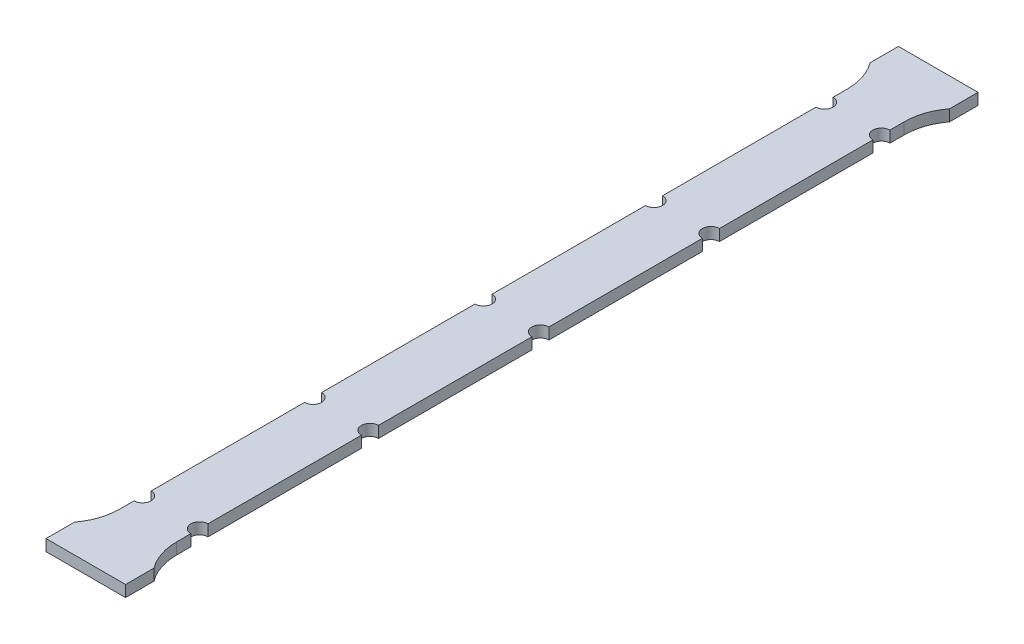
ISO-10303-21;
HEADER;
FILE_DESCRIPTION(('STEP AP214'),'2;1');
FILE_NAME('part.step','',(''),(''),'','','');
FILE_SCHEMA(('AUTOMOTIVE_DESIGN { 1 0 10303 214 1 1 1 1 }'));
ENDSEC;
DATA;
#1=APPLICATION_CONTEXT('core data for automotive mechanical design processes');
#2=APPLICATION_PROTOCOL_DEFINITION('international standard','automotive_design',2000,#1);
#3=PRODUCT_CONTEXT('',#1,'mechanical');
#4=PRODUCT('Part','Part','',(#3));
#5=PRODUCT_RELATED_PRODUCT_CATEGORY('part','',(#4));
#6=PRODUCT_DEFINITION_FORMATION('','',#4);
#7=PRODUCT_DEFINITION_CONTEXT('part definition',#1,'design');
#8=PRODUCT_DEFINITION('design','',#6,#7);
#9=PRODUCT_DEFINITION_SHAPE('','',#8);
#10=(LENGTH_UNIT() NAMED_UNIT(*) SI_UNIT(.MILLI.,.METRE.));
#11=(NAMED_UNIT(*) PLANE_ANGLE_UNIT() SI_UNIT($,.RADIAN.));
#12=(NAMED_UNIT(*) SI_UNIT($,.STERADIAN.) SOLID_ANGLE_UNIT());
#13=UNCERTAINTY_MEASURE_WITH_UNIT(LENGTH_MEASURE(1.E-05),#10,'distance_accuracy_value','');
#14=(GEOMETRIC_REPRESENTATION_CONTEXT(3) GLOBAL_UNCERTAINTY_ASSIGNED_CONTEXT((#13)) GLOBAL_UNIT_ASSIGNED_CONTEXT((#10,
#11,#12)) REPRESENTATION_CONTEXT('',''));
#15=CARTESIAN_POINT('',(0.,0.,0.));
#16=DIRECTION('',(0.,0.,1.));
#17=DIRECTION('',(1.,0.,0.));
#18=AXIS2_PLACEMENT_3D('',#15,#16,#17);
#19=CARTESIAN_POINT('',(0.,2.,75.0000000000001));
#20=DIRECTION('',(0.,-1.,0.));
#21=DIRECTION('',(0.,0.,-1.));
#22=AXIS2_PLACEMENT_3D('',#19,#20,#21);
#23=CYLINDRICAL_SURFACE('',#22,1.5);
#24=CARTESIAN_POINT('',(0.,0.,75.0000000000001));
#25=DIRECTION('',(0.,1.,0.));
#26=DIRECTION('',(0.,0.,1.));
#27=AXIS2_PLACEMENT_3D('',#24,#25,#26);
#28=CIRCLE('',#27,1.5);
#29=CARTESIAN_POINT('',(0.,0.,76.5000000000001));
#30=VERTEX_POINT('',#29);
#31=CARTESIAN_POINT('',(0.,0.,73.5000000000001));
#32=VERTEX_POINT('',#31);
#33=EDGE_CURVE('E261',#30,#32,#28,.T.);
#34=ORIENTED_EDGE('',*,*,#33,.F.);
#35=DIRECTION('',(0.,-1.,0.));
#36=VECTOR('',#35,1.);
#37=CARTESIAN_POINT('',(0.,2.,76.5000000000001));
#38=LINE('',#37,#36);
#39=CARTESIAN_POINT('',(0.,2.,76.5000000000001));
#40=VERTEX_POINT('',#39);
#41=EDGE_CURVE('E256',#40,#30,#38,.T.);
#42=ORIENTED_EDGE('',*,*,#41,.F.);
#43=CARTESIAN_POINT('',(0.,2.,75.0000000000001));
#44=DIRECTION('',(0.,1.,0.));
#45=DIRECTION('',(0.,0.,1.));
#46=AXIS2_PLACEMENT_3D('',#43,#44,#45);
#47=CIRCLE('',#46,1.5);
#48=CARTESIAN_POINT('',(0.,2.,73.5000000000001));
#49=VERTEX_POINT('',#48);
#50=EDGE_CURVE('E259',#40,#49,#47,.T.);
#51=ORIENTED_EDGE('',*,*,#50,.T.);
#52=DIRECTION('',(0.,-1.,0.));
#53=VECTOR('',#52,1.);
#54=CARTESIAN_POINT('',(0.,2.,73.5000000000001));
#55=LINE('',#54,#53);
#56=EDGE_CURVE('E458',#49,#32,#55,.T.);
#57=ORIENTED_EDGE('',*,*,#56,.T.);
#58=EDGE_LOOP('',(#34,#42,#51,#57));
#59=FACE_BOUND('',#58,.T.);
#60=ADVANCED_FACE('F46',(#59),#23,.F.);
#61=CARTESIAN_POINT('',(0.,2.,0.));
#62=DIRECTION('',(1.,0.,0.));
#63=DIRECTION('',(0.,0.,-1.));
#64=AXIS2_PLACEMENT_3D('',#61,#62,#63);
#65=PLANE('',#64);
#66=DIRECTION('',(0.,0.,1.));
#67=VECTOR('',#66,1.);
#68=CARTESIAN_POINT('',(0.,0.,0.));
#69=LINE('',#68,#67);
#70=CARTESIAN_POINT('',(0.,0.,103.5));
#71=VERTEX_POINT('',#70);
#72=EDGE_CURVE('E403',#30,#71,#69,.T.);
#73=ORIENTED_EDGE('',*,*,#72,.T.);
#74=DIRECTION('',(0.,-1.,0.));
#75=VECTOR('',#74,1.);
#76=CARTESIAN_POINT('',(0.,2.,103.5));
#77=LINE('',#76,#75);
#78=CARTESIAN_POINT('',(0.,2.,103.5));
#79=VERTEX_POINT('',#78);
#80=EDGE_CURVE('E266',#79,#71,#77,.T.);
#81=ORIENTED_EDGE('',*,*,#80,.F.);
#82=DIRECTION('',(0.,0.,1.));
#83=VECTOR('',#82,1.);
#84=CARTESIAN_POINT('',(0.,2.,0.));
#85=LINE('',#84,#83);
#86=EDGE_CURVE('E269',#40,#79,#85,.T.);
#87=ORIENTED_EDGE('',*,*,#86,.F.);
#88=ORIENTED_EDGE('',*,*,#41,.T.);
#89=EDGE_LOOP('',(#73,#81,#87,#88));
#90=FACE_BOUND('',#89,.T.);
#91=ADVANCED_FACE('F270',(#90),#65,.F.);
#92=CARTESIAN_POINT('',(3.3133218391157E-13,2.,105.));
#93=DIRECTION('',(0.,-1.,0.));
#94=DIRECTION('',(0.,0.,-1.));
#95=AXIS2_PLACEMENT_3D('',#92,#93,#94);
#96=CYLINDRICAL_SURFACE('',#95,1.5);
#97=CARTESIAN_POINT('',(3.3133218391157E-13,0.,105.));
#98=DIRECTION('',(0.,1.,0.));
#99=DIRECTION('',(0.,0.,1.));
#100=AXIS2_PLACEMENT_3D('',#97,#98,#99);
#101=CIRCLE('',#100,1.5);
#102=CARTESIAN_POINT('',(0.,0.,106.5));
#103=VERTEX_POINT('',#102);
#104=EDGE_CURVE('E405',#103,#71,#101,.T.);
#105=ORIENTED_EDGE('',*,*,#104,.F.);
#106=DIRECTION('',(0.,-1.,0.));
#107=VECTOR('',#106,1.);
#108=CARTESIAN_POINT('',(0.,2.,106.5));
#109=LINE('',#108,#107);
#110=CARTESIAN_POINT('',(0.,2.,106.5));
#111=VERTEX_POINT('',#110);
#112=EDGE_CURVE('E516',#111,#103,#109,.T.);
#113=ORIENTED_EDGE('',*,*,#112,.F.);
#114=CARTESIAN_POINT('',(3.3133218391157E-13,2.,105.));
#115=DIRECTION('',(0.,1.,0.));
#116=DIRECTION('',(0.,0.,1.));
#117=AXIS2_PLACEMENT_3D('',#114,#115,#116);
#118=CIRCLE('',#117,1.5);
#119=EDGE_CURVE('E275',#111,#79,#118,.T.);
#120=ORIENTED_EDGE('',*,*,#119,.T.);
#121=ORIENTED_EDGE('',*,*,#80,.T.);
#122=EDGE_LOOP('',(#105,#113,#120,#121));
#123=FACE_BOUND('',#122,.T.);
#124=ADVANCED_FACE('F670',(#123),#96,.F.);
#125=CARTESIAN_POINT('',(0.,0.,133.5));
#126=VERTEX_POINT('',#125);
#127=EDGE_CURVE('E407',#103,#126,#69,.T.);
#128=ORIENTED_EDGE('',*,*,#127,.T.);
#129=DIRECTION('',(0.,-1.,0.));
#130=VECTOR('',#129,1.);
#131=CARTESIAN_POINT('',(0.,2.,133.5));
#132=LINE('',#131,#130);
#133=CARTESIAN_POINT('',(0.,2.,133.5));
#134=VERTEX_POINT('',#133);
#135=EDGE_CURVE('E514',#134,#126,#132,.T.);
#136=ORIENTED_EDGE('',*,*,#135,.F.);
#137=EDGE_CURVE('E278',#111,#134,#85,.T.);
#138=ORIENTED_EDGE('',*,*,#137,.F.);
#139=ORIENTED_EDGE('',*,*,#112,.T.);
#140=EDGE_LOOP('',(#128,#136,#138,#139));
#141=FACE_BOUND('',#140,.T.);
#142=ADVANCED_FACE('F660',(#141),#65,.F.);
#143=CARTESIAN_POINT('',(6.43582409587395E-13,2.,135.));
#144=DIRECTION('',(0.,-1.,0.));
#145=DIRECTION('',(0.,0.,-1.));
#146=AXIS2_PLACEMENT_3D('',#143,#144,#145);
#147=CYLINDRICAL_SURFACE('',#146,1.5);
#148=CARTESIAN_POINT('',(6.43582409587395E-13,0.,135.));
#149=DIRECTION('',(0.,1.,0.));
#150=DIRECTION('',(0.,0.,1.));
#151=AXIS2_PLACEMENT_3D('',#148,#149,#150);
#152=CIRCLE('',#151,1.5);
#153=CARTESIAN_POINT('',(0.,0.,136.5));
#154=VERTEX_POINT('',#153);
#155=EDGE_CURVE('E410',#154,#126,#152,.T.);
#156=ORIENTED_EDGE('',*,*,#155,.F.);
#157=DIRECTION('',(0.,-1.,0.));
#158=VECTOR('',#157,1.);
#159=CARTESIAN_POINT('',(0.,2.,136.5));
#160=LINE('',#159,#158);
#161=CARTESIAN_POINT('',(0.,2.,136.5));
#162=VERTEX_POINT('',#161);
#163=EDGE_CURVE('E512',#162,#154,#160,.T.);
#164=ORIENTED_EDGE('',*,*,#163,.F.);
#165=CARTESIAN_POINT('',(6.43582409587395E-13,2.,135.));
#166=DIRECTION('',(0.,1.,0.));
#167=DIRECTION('',(0.,0.,1.));
#168=AXIS2_PLACEMENT_3D('',#165,#166,#167);
#169=CIRCLE('',#168,1.5);
#170=EDGE_CURVE('E303',#162,#134,#169,.T.);
#171=ORIENTED_EDGE('',*,*,#170,.T.);
#172=ORIENTED_EDGE('',*,*,#135,.T.);
#173=EDGE_LOOP('',(#156,#164,#171,#172));
#174=FACE_BOUND('',#173,.T.);
#175=ADVANCED_FACE('F664',(#174),#147,.F.);
#176=CARTESIAN_POINT('',(0.,0.,139.));
#177=VERTEX_POINT('',#176);
#178=EDGE_CURVE('E406',#154,#177,#69,.T.);
#179=ORIENTED_EDGE('',*,*,#178,.T.);
#180=DIRECTION('',(0.,1.,0.));
#181=VECTOR('',#180,1.);
#182=CARTESIAN_POINT('',(0.,2.,139.));
#183=LINE('',#182,#181);
#184=CARTESIAN_POINT('',(0.,2.,139.));
#185=VERTEX_POINT('',#184);
#186=EDGE_CURVE('E521',#177,#185,#183,.T.);
#187=ORIENTED_EDGE('',*,*,#186,.T.);
#188=EDGE_CURVE('E277',#162,#185,#85,.T.);
#189=ORIENTED_EDGE('',*,*,#188,.F.);
#190=ORIENTED_EDGE('',*,*,#163,.T.);
#191=EDGE_LOOP('',(#179,#187,#189,#190));
#192=FACE_BOUND('',#191,.T.);
#193=ADVANCED_FACE('F653',(#192),#65,.F.);
#194=CARTESIAN_POINT('',(-1.99999999999998,2.,0.));
#195=DIRECTION('',(-1.,0.,0.));
#196=DIRECTION('',(0.,0.,1.));
#197=AXIS2_PLACEMENT_3D('',#194,#195,#196);
#198=PLANE('',#197);
#199=DIRECTION('',(0.,0.,-1.));
#200=VECTOR('',#199,1.);
#201=CARTESIAN_POINT('',(-1.99999999999998,0.,0.));
#202=LINE('',#201,#200);
#203=CARTESIAN_POINT('',(-1.99999999999998,0.,150.));
#204=VERTEX_POINT('',#203);
#205=CARTESIAN_POINT('',(-1.99999999999998,0.,145.));
#206=VERTEX_POINT('',#205);
#207=EDGE_CURVE('E413',#204,#206,#202,.T.);
#208=ORIENTED_EDGE('',*,*,#207,.F.);
#209=DIRECTION('',(0.,-1.,0.));
#210=VECTOR('',#209,1.);
#211=CARTESIAN_POINT('',(-1.99999999999998,2.,150.));
#212=LINE('',#211,#210);
#213=CARTESIAN_POINT('',(-1.99999999999998,2.,150.));
#214=VERTEX_POINT('',#213);
#215=EDGE_CURVE('E507',#214,#204,#212,.T.);
#216=ORIENTED_EDGE('',*,*,#215,.F.);
#217=DIRECTION('',(0.,0.,-1.));
#218=VECTOR('',#217,1.);
#219=CARTESIAN_POINT('',(-1.99999999999998,2.,0.));
#220=LINE('',#219,#218);
#221=CARTESIAN_POINT('',(-1.99999999999998,2.,145.));
#222=VERTEX_POINT('',#221);
#223=EDGE_CURVE('E308',#214,#222,#220,.T.);
#224=ORIENTED_EDGE('',*,*,#223,.T.);
#225=DIRECTION('',(0.,-1.,0.));
#226=VECTOR('',#225,1.);
#227=CARTESIAN_POINT('',(-1.99999999999998,2.,145.));
#228=LINE('',#227,#226);
#229=EDGE_CURVE('E509',#222,#206,#228,.T.);
#230=ORIENTED_EDGE('',*,*,#229,.T.);
#231=EDGE_LOOP('',(#208,#216,#224,#230));
#232=FACE_BOUND('',#231,.T.);
#233=ADVANCED_FACE('F640',(#232),#198,.T.);
#234=CARTESIAN_POINT('',(0.,2.,150.));
#235=DIRECTION('',(0.,0.,-1.));
#236=DIRECTION('',(-1.,0.,0.));
#237=AXIS2_PLACEMENT_3D('',#234,#235,#236);
#238=PLANE('',#237);
#239=DIRECTION('',(1.,0.,0.));
#240=VECTOR('',#239,1.);
#241=CARTESIAN_POINT('',(0.,0.,150.));
#242=LINE('',#241,#240);
#243=CARTESIAN_POINT('',(12.,0.,150.));
#244=VERTEX_POINT('',#243);
#245=EDGE_CURVE('E416',#204,#244,#242,.T.);
#246=ORIENTED_EDGE('',*,*,#245,.T.);
#247=DIRECTION('',(0.,-1.,0.));
#248=VECTOR('',#247,1.);
#249=CARTESIAN_POINT('',(12.,2.,150.));
#250=LINE('',#249,#248);
#251=CARTESIAN_POINT('',(12.,2.,150.));
#252=VERTEX_POINT('',#251);
#253=EDGE_CURVE('E504',#252,#244,#250,.T.);
#254=ORIENTED_EDGE('',*,*,#253,.F.);
#255=DIRECTION('',(1.,0.,0.));
#256=VECTOR('',#255,1.);
#257=CARTESIAN_POINT('',(0.,2.,150.));
#258=LINE('',#257,#256);
#259=EDGE_CURVE('E317',#214,#252,#258,.T.);
#260=ORIENTED_EDGE('',*,*,#259,.F.);
#261=ORIENTED_EDGE('',*,*,#215,.T.);
#262=EDGE_LOOP('',(#246,#254,#260,#261));
#263=FACE_BOUND('',#262,.T.);
#264=ADVANCED_FACE('F814',(#263),#238,.F.);
#265=CARTESIAN_POINT('',(12.,2.,0.));
#266=DIRECTION('',(-1.,0.,0.));
#267=DIRECTION('',(0.,0.,1.));
#268=AXIS2_PLACEMENT_3D('',#265,#266,#267);
#269=PLANE('',#268);
#270=DIRECTION('',(0.,0.,-1.));
#271=VECTOR('',#270,1.);
#272=CARTESIAN_POINT('',(12.,0.,0.));
#273=LINE('',#272,#271);
#274=CARTESIAN_POINT('',(12.,0.,145.));
#275=VERTEX_POINT('',#274);
#276=EDGE_CURVE('E418',#244,#275,#273,.T.);
#277=ORIENTED_EDGE('',*,*,#276,.T.);
#278=DIRECTION('',(0.,-1.,0.));
#279=VECTOR('',#278,1.);
#280=CARTESIAN_POINT('',(12.,2.,145.));
#281=LINE('',#280,#279);
#282=CARTESIAN_POINT('',(12.,2.,145.));
#283=VERTEX_POINT('',#282);
#284=EDGE_CURVE('E501',#283,#275,#281,.T.);
#285=ORIENTED_EDGE('',*,*,#284,.F.);
#286=DIRECTION('',(0.,0.,-1.));
#287=VECTOR('',#286,1.);
#288=CARTESIAN_POINT('',(12.,2.,0.));
#289=LINE('',#288,#287);
#290=EDGE_CURVE('E320',#252,#283,#289,.T.);
#291=ORIENTED_EDGE('',*,*,#290,.F.);
#292=ORIENTED_EDGE('',*,*,#253,.T.);
#293=EDGE_LOOP('',(#277,#285,#291,#292));
#294=FACE_BOUND('',#293,.T.);
#295=ADVANCED_FACE('F634',(#294),#269,.F.);
#296=CARTESIAN_POINT('',(10.,2.,0.));
#297=DIRECTION('',(-1.,0.,0.));
#298=DIRECTION('',(0.,0.,1.));
#299=AXIS2_PLACEMENT_3D('',#296,#297,#298);
#300=PLANE('',#299);
#301=DIRECTION('',(0.,0.,-1.));
#302=VECTOR('',#301,1.);
#303=CARTESIAN_POINT('',(10.,2.,0.));
#304=LINE('',#303,#302);
#305=CARTESIAN_POINT('',(10.,2.,139.));
#306=VERTEX_POINT('',#305);
#307=CARTESIAN_POINT('',(10.,2.,136.5));
#308=VERTEX_POINT('',#307);
#309=EDGE_CURVE('E324',#306,#308,#304,.T.);
#310=ORIENTED_EDGE('',*,*,#309,.F.);
#311=DIRECTION('',(0.,-1.,0.));
#312=VECTOR('',#311,1.);
#313=CARTESIAN_POINT('',(10.,2.,139.));
#314=LINE('',#313,#312);
#315=CARTESIAN_POINT('',(10.,0.,139.));
#316=VERTEX_POINT('',#315);
#317=EDGE_CURVE('E265',#306,#316,#314,.T.);
#318=ORIENTED_EDGE('',*,*,#317,.T.);
#319=DIRECTION('',(0.,0.,-1.));
#320=VECTOR('',#319,1.);
#321=CARTESIAN_POINT('',(10.,0.,0.));
#322=LINE('',#321,#320);
#323=CARTESIAN_POINT('',(10.,0.,136.5));
#324=VERTEX_POINT('',#323);
#325=EDGE_CURVE('E421',#316,#324,#322,.T.);
#326=ORIENTED_EDGE('',*,*,#325,.T.);
#327=DIRECTION('',(0.,-1.,0.));
#328=VECTOR('',#327,1.);
#329=CARTESIAN_POINT('',(10.,2.,136.5));
#330=LINE('',#329,#328);
#331=EDGE_CURVE('E498',#308,#324,#330,.T.);
#332=ORIENTED_EDGE('',*,*,#331,.F.);
#333=EDGE_LOOP('',(#310,#318,#326,#332));
#334=FACE_BOUND('',#333,.T.);
#335=ADVANCED_FACE('F626',(#334),#300,.F.);
#336=CARTESIAN_POINT('',(10.0000000000006,2.,135.));
#337=DIRECTION('',(0.,-1.,0.));
#338=DIRECTION('',(0.,0.,-1.));
#339=AXIS2_PLACEMENT_3D('',#336,#337,#338);
#340=CYLINDRICAL_SURFACE('',#339,1.5);
#341=CARTESIAN_POINT('',(10.0000000000006,0.,135.));
#342=DIRECTION('',(0.,1.,0.));
#343=DIRECTION('',(0.,0.,1.));
#344=AXIS2_PLACEMENT_3D('',#341,#342,#343);
#345=CIRCLE('',#344,1.5);
#346=CARTESIAN_POINT('',(10.,0.,133.5));
#347=VERTEX_POINT('',#346);
#348=EDGE_CURVE('E423',#347,#324,#345,.T.);
#349=ORIENTED_EDGE('',*,*,#348,.F.);
#350=DIRECTION('',(0.,-1.,0.));
#351=VECTOR('',#350,1.);
#352=CARTESIAN_POINT('',(10.,2.,133.5));
#353=LINE('',#352,#351);
#354=CARTESIAN_POINT('',(10.,2.,133.5));
#355=VERTEX_POINT('',#354);
#356=EDGE_CURVE('E496',#355,#347,#353,.T.);
#357=ORIENTED_EDGE('',*,*,#356,.F.);
#358=CARTESIAN_POINT('',(10.0000000000006,2.,135.));
#359=DIRECTION('',(0.,1.,0.));
#360=DIRECTION('',(0.,0.,1.));
#361=AXIS2_PLACEMENT_3D('',#358,#359,#360);
#362=CIRCLE('',#361,1.5);
#363=EDGE_CURVE('E328',#355,#308,#362,.T.);
#364=ORIENTED_EDGE('',*,*,#363,.T.);
#365=ORIENTED_EDGE('',*,*,#331,.T.);
#366=EDGE_LOOP('',(#349,#357,#364,#365));
#367=FACE_BOUND('',#366,.T.);
#368=ADVANCED_FACE('F620',(#367),#340,.F.);
#369=CARTESIAN_POINT('',(10.,0.,106.5));
#370=VERTEX_POINT('',#369);
#371=EDGE_CURVE('E425',#347,#370,#322,.T.);
#372=ORIENTED_EDGE('',*,*,#371,.T.);
#373=DIRECTION('',(0.,-1.,0.));
#374=VECTOR('',#373,1.);
#375=CARTESIAN_POINT('',(10.,2.,106.5));
#376=LINE('',#375,#374);
#377=CARTESIAN_POINT('',(10.,2.,106.5));
#378=VERTEX_POINT('',#377);
#379=EDGE_CURVE('E494',#378,#370,#376,.T.);
#380=ORIENTED_EDGE('',*,*,#379,.F.);
#381=EDGE_CURVE('E330',#355,#378,#304,.T.);
#382=ORIENTED_EDGE('',*,*,#381,.F.);
#383=ORIENTED_EDGE('',*,*,#356,.T.);
#384=EDGE_LOOP('',(#372,#380,#382,#383));
#385=FACE_BOUND('',#384,.T.);
#386=ADVANCED_FACE('F608',(#385),#300,.F.);
#387=CARTESIAN_POINT('',(10.0000000000003,2.,105.));
#388=DIRECTION('',(0.,-1.,0.));
#389=DIRECTION('',(0.,0.,-1.));
#390=AXIS2_PLACEMENT_3D('',#387,#388,#389);
#391=CYLINDRICAL_SURFACE('',#390,1.5);
#392=CARTESIAN_POINT('',(10.0000000000003,0.,105.));
#393=DIRECTION('',(0.,1.,0.));
#394=DIRECTION('',(0.,0.,1.));
#395=AXIS2_PLACEMENT_3D('',#392,#393,#394);
#396=CIRCLE('',#395,1.5);
#397=CARTESIAN_POINT('',(10.,0.,103.5));
#398=VERTEX_POINT('',#397);
#399=EDGE_CURVE('E428',#398,#370,#396,.T.);
#400=ORIENTED_EDGE('',*,*,#399,.F.);
#401=DIRECTION('',(0.,-1.,0.));
#402=VECTOR('',#401,1.);
#403=CARTESIAN_POINT('',(10.,2.,103.5));
#404=LINE('',#403,#402);
#405=CARTESIAN_POINT('',(10.,2.,103.5));
#406=VERTEX_POINT('',#405);
#407=EDGE_CURVE('E492',#406,#398,#404,.T.);
#408=ORIENTED_EDGE('',*,*,#407,.F.);
#409=CARTESIAN_POINT('',(10.0000000000003,2.,105.));
#410=DIRECTION('',(0.,1.,0.));
#411=DIRECTION('',(0.,0.,1.));
#412=AXIS2_PLACEMENT_3D('',#409,#410,#411);
#413=CIRCLE('',#412,1.5);
#414=EDGE_CURVE('E340',#406,#378,#413,.T.);
#415=ORIENTED_EDGE('',*,*,#414,.T.);
#416=ORIENTED_EDGE('',*,*,#379,.T.);
#417=EDGE_LOOP('',(#400,#408,#415,#416));
#418=FACE_BOUND('',#417,.T.);
#419=ADVANCED_FACE('F612',(#418),#391,.F.);
#420=CARTESIAN_POINT('',(10.,0.,76.5));
#421=VERTEX_POINT('',#420);
#422=EDGE_CURVE('E424',#398,#421,#322,.T.);
#423=ORIENTED_EDGE('',*,*,#422,.T.);
#424=DIRECTION('',(0.,-1.,0.));
#425=VECTOR('',#424,1.);
#426=CARTESIAN_POINT('',(10.,2.,76.5));
#427=LINE('',#426,#425);
#428=CARTESIAN_POINT('',(10.,2.,76.5));
#429=VERTEX_POINT('',#428);
#430=EDGE_CURVE('E490',#429,#421,#427,.T.);
#431=ORIENTED_EDGE('',*,*,#430,.F.);
#432=EDGE_CURVE('E329',#406,#429,#304,.T.);
#433=ORIENTED_EDGE('',*,*,#432,.F.);
#434=ORIENTED_EDGE('',*,*,#407,.T.);
#435=EDGE_LOOP('',(#423,#431,#433,#434));
#436=FACE_BOUND('',#435,.T.);
#437=ADVANCED_FACE('F602',(#436),#300,.F.);
#438=CARTESIAN_POINT('',(10.,2.,75.));
#439=DIRECTION('',(0.,-1.,0.));
#440=DIRECTION('',(0.,0.,-1.));
#441=AXIS2_PLACEMENT_3D('',#438,#439,#440);
#442=CYLINDRICAL_SURFACE('',#441,1.5);
#443=CARTESIAN_POINT('',(10.,0.,75.));
#444=DIRECTION('',(0.,1.,0.));
#445=DIRECTION('',(0.,0.,1.));
#446=AXIS2_PLACEMENT_3D('',#443,#444,#445);
#447=CIRCLE('',#446,1.5);
#448=CARTESIAN_POINT('',(10.,0.,73.5));
#449=VERTEX_POINT('',#448);
#450=EDGE_CURVE('E431',#449,#421,#447,.T.);
#451=ORIENTED_EDGE('',*,*,#450,.F.);
#452=DIRECTION('',(0.,-1.,0.));
#453=VECTOR('',#452,1.);
#454=CARTESIAN_POINT('',(10.,2.,73.5));
#455=LINE('',#454,#453);
#456=CARTESIAN_POINT('',(10.,2.,73.5));
#457=VERTEX_POINT('',#456);
#458=EDGE_CURVE('E488',#457,#449,#455,.T.);
#459=ORIENTED_EDGE('',*,*,#458,.F.);
#460=CARTESIAN_POINT('',(10.,2.,75.));
#461=DIRECTION('',(0.,1.,0.));
#462=DIRECTION('',(0.,0.,1.));
#463=AXIS2_PLACEMENT_3D('',#460,#461,#462);
#464=CIRCLE('',#463,1.5);
#465=EDGE_CURVE('E345',#457,#429,#464,.T.);
#466=ORIENTED_EDGE('',*,*,#465,.T.);
#467=ORIENTED_EDGE('',*,*,#430,.T.);
#468=EDGE_LOOP('',(#451,#459,#466,#467));
#469=FACE_BOUND('',#468,.T.);
#470=ADVANCED_FACE('F597',(#469),#442,.F.);
#471=CARTESIAN_POINT('',(10.,2.,0.));
#472=DIRECTION('',(-1.,0.,0.));
#473=DIRECTION('',(0.,0.,1.));
#474=AXIS2_PLACEMENT_3D('',#471,#472,#473);
#475=PLANE('',#474);
#476=DIRECTION('',(0.,0.,-1.));
#477=VECTOR('',#476,1.);
#478=CARTESIAN_POINT('',(10.,0.,0.));
#479=LINE('',#478,#477);
#480=CARTESIAN_POINT('',(10.,0.,46.5));
#481=VERTEX_POINT('',#480);
#482=EDGE_CURVE('E434',#449,#481,#479,.T.);
#483=ORIENTED_EDGE('',*,*,#482,.T.);
#484=DIRECTION('',(0.,-1.,0.));
#485=VECTOR('',#484,1.);
#486=CARTESIAN_POINT('',(10.,2.,46.5));
#487=LINE('',#486,#485);
#488=CARTESIAN_POINT('',(10.,2.,46.5));
#489=VERTEX_POINT('',#488);
#490=EDGE_CURVE('E486',#489,#481,#487,.T.);
#491=ORIENTED_EDGE('',*,*,#490,.F.);
#492=DIRECTION('',(0.,0.,-1.));
#493=VECTOR('',#492,1.);
#494=CARTESIAN_POINT('',(10.,2.,0.));
#495=LINE('',#494,#493);
#496=EDGE_CURVE('E350',#457,#489,#495,.T.);
#497=ORIENTED_EDGE('',*,*,#496,.F.);
#498=ORIENTED_EDGE('',*,*,#458,.T.);
#499=EDGE_LOOP('',(#483,#491,#497,#498));
#500=FACE_BOUND('',#499,.T.);
#501=ADVANCED_FACE('F579',(#500),#475,.F.);
#502=CARTESIAN_POINT('',(10.,2.,45.));
#503=DIRECTION('',(0.,-1.,0.));
#504=DIRECTION('',(0.,0.,-1.));
#505=AXIS2_PLACEMENT_3D('',#502,#503,#504);
#506=CYLINDRICAL_SURFACE('',#505,1.5);
#507=CARTESIAN_POINT('',(10.,0.,45.));
#508=DIRECTION('',(0.,1.,0.));
#509=DIRECTION('',(0.,0.,1.));
#510=AXIS2_PLACEMENT_3D('',#507,#508,#509);
#511=CIRCLE('',#510,1.5);
#512=CARTESIAN_POINT('',(10.,0.,43.5));
#513=VERTEX_POINT('',#512);
#514=EDGE_CURVE('E437',#513,#481,#511,.T.);
#515=ORIENTED_EDGE('',*,*,#514,.F.);
#516=DIRECTION('',(0.,-1.,0.));
#517=VECTOR('',#516,1.);
#518=CARTESIAN_POINT('',(10.,2.,43.5));
#519=LINE('',#518,#517);
#520=CARTESIAN_POINT('',(10.,2.,43.5));
#521=VERTEX_POINT('',#520);
#522=EDGE_CURVE('E484',#521,#513,#519,.T.);
#523=ORIENTED_EDGE('',*,*,#522,.F.);
#524=CARTESIAN_POINT('',(10.,2.,45.));
#525=DIRECTION('',(0.,1.,0.));
#526=DIRECTION('',(0.,0.,1.));
#527=AXIS2_PLACEMENT_3D('',#524,#525,#526);
#528=CIRCLE('',#527,1.5);
#529=EDGE_CURVE('E357',#521,#489,#528,.T.);
#530=ORIENTED_EDGE('',*,*,#529,.T.);
#531=ORIENTED_EDGE('',*,*,#490,.T.);
#532=EDGE_LOOP('',(#515,#523,#530,#531));
#533=FACE_BOUND('',#532,.T.);
#534=ADVANCED_FACE('F583',(#533),#506,.F.);
#535=CARTESIAN_POINT('',(10.,0.,16.5));
#536=VERTEX_POINT('',#535);
#537=EDGE_CURVE('E439',#513,#536,#479,.T.);
#538=ORIENTED_EDGE('',*,*,#537,.T.);
#539=DIRECTION('',(0.,-1.,0.));
#540=VECTOR('',#539,1.);
#541=CARTESIAN_POINT('',(10.,2.,16.5));
#542=LINE('',#541,#540);
#543=CARTESIAN_POINT('',(10.,2.,16.5));
#544=VERTEX_POINT('',#543);
#545=EDGE_CURVE('E482',#544,#536,#542,.T.);
#546=ORIENTED_EDGE('',*,*,#545,.F.);
#547=EDGE_CURVE('E362',#521,#544,#495,.T.);
#548=ORIENTED_EDGE('',*,*,#547,.F.);
#549=ORIENTED_EDGE('',*,*,#522,.T.);
#550=EDGE_LOOP('',(#538,#546,#548,#549));
#551=FACE_BOUND('',#550,.T.);
#552=ADVANCED_FACE('F589',(#551),#475,.F.);
#553=CARTESIAN_POINT('',(10.,2.,15.));
#554=DIRECTION('',(0.,-1.,0.));
#555=DIRECTION('',(0.,0.,-1.));
#556=AXIS2_PLACEMENT_3D('',#553,#554,#555);
#557=CYLINDRICAL_SURFACE('',#556,1.5);
#558=CARTESIAN_POINT('',(10.,0.,15.));
#559=DIRECTION('',(0.,1.,0.));
#560=DIRECTION('',(0.,0.,1.));
#561=AXIS2_PLACEMENT_3D('',#558,#559,#560);
#562=CIRCLE('',#561,1.5);
#563=CARTESIAN_POINT('',(10.,0.,13.5));
#564=VERTEX_POINT('',#563);
#565=EDGE_CURVE('E442',#564,#536,#562,.T.);
#566=ORIENTED_EDGE('',*,*,#565,.F.);
#567=DIRECTION('',(0.,-1.,0.));
#568=VECTOR('',#567,1.);
#569=CARTESIAN_POINT('',(10.,2.,13.5));
#570=LINE('',#569,#568);
#571=CARTESIAN_POINT('',(10.,2.,13.5));
#572=VERTEX_POINT('',#571);
#573=EDGE_CURVE('E480',#572,#564,#570,.T.);
#574=ORIENTED_EDGE('',*,*,#573,.F.);
#575=CARTESIAN_POINT('',(10.,2.,15.));
#576=DIRECTION('',(0.,1.,0.));
#577=DIRECTION('',(0.,0.,1.));
#578=AXIS2_PLACEMENT_3D('',#575,#576,#577);
#579=CIRCLE('',#578,1.5);
#580=EDGE_CURVE('E363',#572,#544,#579,.T.);
#581=ORIENTED_EDGE('',*,*,#580,.T.);
#582=ORIENTED_EDGE('',*,*,#545,.T.);
#583=EDGE_LOOP('',(#566,#574,#581,#582));
#584=FACE_BOUND('',#583,.T.);
#585=ADVANCED_FACE('F592',(#584),#557,.F.);
#586=CARTESIAN_POINT('',(10.,0.,10.9999999999993));
#587=VERTEX_POINT('',#586);
#588=EDGE_CURVE('E438',#564,#587,#479,.T.);
#589=ORIENTED_EDGE('',*,*,#588,.T.);
#590=DIRECTION('',(0.,1.,0.));
#591=VECTOR('',#590,1.);
#592=CARTESIAN_POINT('',(10.,2.,10.9999999999993));
#593=LINE('',#592,#591);
#594=CARTESIAN_POINT('',(10.,2.,10.9999999999993));
#595=VERTEX_POINT('',#594);
#596=EDGE_CURVE('E62',#587,#595,#593,.T.);
#597=ORIENTED_EDGE('',*,*,#596,.T.);
#598=EDGE_CURVE('E368',#572,#595,#495,.T.);
#599=ORIENTED_EDGE('',*,*,#598,.F.);
#600=ORIENTED_EDGE('',*,*,#573,.T.);
#601=EDGE_LOOP('',(#589,#597,#599,#600));
#602=FACE_BOUND('',#601,.T.);
#603=ADVANCED_FACE('F593',(#602),#475,.F.);
#604=CARTESIAN_POINT('',(11.9999999999995,2.,0.));
#605=DIRECTION('',(-1.,0.,0.));
#606=DIRECTION('',(0.,0.,1.));
#607=AXIS2_PLACEMENT_3D('',#604,#605,#606);
#608=PLANE('',#607);
#609=DIRECTION('',(0.,0.,-1.));
#610=VECTOR('',#609,1.);
#611=CARTESIAN_POINT('',(11.9999999999995,0.,0.));
#612=LINE('',#611,#610);
#613=CARTESIAN_POINT('',(11.9999999999995,0.,5.));
#614=VERTEX_POINT('',#613);
#615=CARTESIAN_POINT('',(11.9999999999995,0.,0.));
#616=VERTEX_POINT('',#615);
#617=EDGE_CURVE('E445',#614,#616,#612,.T.);
#618=ORIENTED_EDGE('',*,*,#617,.T.);
#619=DIRECTION('',(0.,-1.,0.));
#620=VECTOR('',#619,1.);
#621=CARTESIAN_POINT('',(11.9999999999995,2.,0.));
#622=LINE('',#621,#620);
#623=CARTESIAN_POINT('',(11.9999999999995,2.,0.));
#624=VERTEX_POINT('',#623);
#625=EDGE_CURVE('E474',#624,#616,#622,.T.);
#626=ORIENTED_EDGE('',*,*,#625,.F.);
#627=DIRECTION('',(0.,0.,-1.));
#628=VECTOR('',#627,1.);
#629=CARTESIAN_POINT('',(11.9999999999995,2.,0.));
#630=LINE('',#629,#628);
#631=CARTESIAN_POINT('',(11.9999999999995,2.,5.));
#632=VERTEX_POINT('',#631);
#633=EDGE_CURVE('E369',#632,#624,#630,.T.);
#634=ORIENTED_EDGE('',*,*,#633,.F.);
#635=DIRECTION('',(0.,-1.,0.));
#636=VECTOR('',#635,1.);
#637=CARTESIAN_POINT('',(11.9999999999995,2.,5.));
#638=LINE('',#637,#636);
#639=EDGE_CURVE('E477',#632,#614,#638,.T.);
#640=ORIENTED_EDGE('',*,*,#639,.T.);
#641=EDGE_LOOP('',(#618,#626,#634,#640));
#642=FACE_BOUND('',#641,.T.);
#643=ADVANCED_FACE('F564',(#642),#608,.F.);
#644=CARTESIAN_POINT('',(0.,2.,0.));
#645=DIRECTION('',(0.,0.,1.));
#646=DIRECTION('',(1.,0.,0.));
#647=AXIS2_PLACEMENT_3D('',#644,#645,#646);
#648=PLANE('',#647);
#649=DIRECTION('',(-1.,0.,0.));
#650=VECTOR('',#649,1.);
#651=CARTESIAN_POINT('',(0.,0.,0.));
#652=LINE('',#651,#650);
#653=CARTESIAN_POINT('',(-2.00000000000048,0.,0.));
#654=VERTEX_POINT('',#653);
#655=EDGE_CURVE('E447',#616,#654,#652,.T.);
#656=ORIENTED_EDGE('',*,*,#655,.T.);
#657=DIRECTION('',(0.,-1.,0.));
#658=VECTOR('',#657,1.);
#659=CARTESIAN_POINT('',(-2.00000000000048,2.,0.));
#660=LINE('',#659,#658);
#661=CARTESIAN_POINT('',(-2.00000000000048,2.,0.));
#662=VERTEX_POINT('',#661);
#663=EDGE_CURVE('E472',#662,#654,#660,.T.);
#664=ORIENTED_EDGE('',*,*,#663,.F.);
#665=DIRECTION('',(-1.,0.,0.));
#666=VECTOR('',#665,1.);
#667=CARTESIAN_POINT('',(0.,2.,0.));
#668=LINE('',#667,#666);
#669=EDGE_CURVE('E378',#624,#662,#668,.T.);
#670=ORIENTED_EDGE('',*,*,#669,.F.);
#671=ORIENTED_EDGE('',*,*,#625,.T.);
#672=EDGE_LOOP('',(#656,#664,#670,#671));
#673=FACE_BOUND('',#672,.T.);
#674=ADVANCED_FACE('F561',(#673),#648,.F.);
#675=CARTESIAN_POINT('',(-2.00000000000048,2.,0.));
#676=DIRECTION('',(-1.,0.,0.));
#677=DIRECTION('',(0.,0.,1.));
#678=AXIS2_PLACEMENT_3D('',#675,#676,#677);
#679=PLANE('',#678);
#680=DIRECTION('',(0.,0.,-1.));
#681=VECTOR('',#680,1.);
#682=CARTESIAN_POINT('',(-2.00000000000048,0.,0.));
#683=LINE('',#682,#681);
#684=CARTESIAN_POINT('',(-2.00000000000048,0.,5.));
#685=VERTEX_POINT('',#684);
#686=EDGE_CURVE('E450',#685,#654,#683,.T.);
#687=ORIENTED_EDGE('',*,*,#686,.F.);
#688=DIRECTION('',(0.,-1.,0.));
#689=VECTOR('',#688,1.);
#690=CARTESIAN_POINT('',(-2.00000000000048,2.,5.));
#691=LINE('',#690,#689);
#692=CARTESIAN_POINT('',(-2.00000000000048,2.,5.));
#693=VERTEX_POINT('',#692);
#694=EDGE_CURVE('E469',#693,#685,#691,.T.);
#695=ORIENTED_EDGE('',*,*,#694,.F.);
#696=DIRECTION('',(0.,0.,-1.));
#697=VECTOR('',#696,1.);
#698=CARTESIAN_POINT('',(-2.00000000000048,2.,0.));
#699=LINE('',#698,#697);
#700=EDGE_CURVE('E381',#693,#662,#699,.T.);
#701=ORIENTED_EDGE('',*,*,#700,.T.);
#702=ORIENTED_EDGE('',*,*,#663,.T.);
#703=EDGE_LOOP('',(#687,#695,#701,#702));
#704=FACE_BOUND('',#703,.T.);
#705=ADVANCED_FACE('F557',(#704),#679,.T.);
#706=CARTESIAN_POINT('',(0.,2.,0.));
#707=DIRECTION('',(1.,0.,0.));
#708=DIRECTION('',(0.,0.,-1.));
#709=AXIS2_PLACEMENT_3D('',#706,#707,#708);
#710=PLANE('',#709);
#711=DIRECTION('',(0.,0.,1.));
#712=VECTOR('',#711,1.);
#713=CARTESIAN_POINT('',(0.,2.,0.));
#714=LINE('',#713,#712);
#715=CARTESIAN_POINT('',(0.,2.,11.0000000000006));
#716=VERTEX_POINT('',#715);
#717=CARTESIAN_POINT('',(0.,2.,13.5));
#718=VERTEX_POINT('',#717);
#719=EDGE_CURVE('E385',#716,#718,#714,.T.);
#720=ORIENTED_EDGE('',*,*,#719,.F.);
#721=DIRECTION('',(0.,-1.,0.));
#722=VECTOR('',#721,1.);
#723=CARTESIAN_POINT('',(0.,2.,11.0000000000006));
#724=LINE('',#723,#722);
#725=CARTESIAN_POINT('',(0.,0.,11.0000000000006));
#726=VERTEX_POINT('',#725);
#727=EDGE_CURVE('E523',#716,#726,#724,.T.);
#728=ORIENTED_EDGE('',*,*,#727,.T.);
#729=DIRECTION('',(0.,0.,1.));
#730=VECTOR('',#729,1.);
#731=CARTESIAN_POINT('',(0.,0.,0.));
#732=LINE('',#731,#730);
#733=CARTESIAN_POINT('',(0.,0.,13.5));
#734=VERTEX_POINT('',#733);
#735=EDGE_CURVE('E291',#726,#734,#732,.T.);
#736=ORIENTED_EDGE('',*,*,#735,.T.);
#737=DIRECTION('',(0.,-1.,0.));
#738=VECTOR('',#737,1.);
#739=CARTESIAN_POINT('',(0.,2.,13.5));
#740=LINE('',#739,#738);
#741=EDGE_CURVE('E466',#718,#734,#740,.T.);
#742=ORIENTED_EDGE('',*,*,#741,.F.);
#743=EDGE_LOOP('',(#720,#728,#736,#742));
#744=FACE_BOUND('',#743,.T.);
#745=ADVANCED_FACE('F549',(#744),#710,.F.);
#746=CARTESIAN_POINT('',(0.,2.,15.));
#747=DIRECTION('',(0.,-1.,0.));
#748=DIRECTION('',(0.,0.,-1.));
#749=AXIS2_PLACEMENT_3D('',#746,#747,#748);
#750=CYLINDRICAL_SURFACE('',#749,1.5);
#751=CARTESIAN_POINT('',(0.,0.,15.));
#752=DIRECTION('',(0.,1.,0.));
#753=DIRECTION('',(0.,0.,1.));
#754=AXIS2_PLACEMENT_3D('',#751,#752,#753);
#755=CIRCLE('',#754,1.5);
#756=CARTESIAN_POINT('',(0.,0.,16.5));
#757=VERTEX_POINT('',#756);
#758=EDGE_CURVE('E453',#757,#734,#755,.T.);
#759=ORIENTED_EDGE('',*,*,#758,.F.);
#760=DIRECTION('',(0.,-1.,0.));
#761=VECTOR('',#760,1.);
#762=CARTESIAN_POINT('',(0.,2.,16.5));
#763=LINE('',#762,#761);
#764=CARTESIAN_POINT('',(0.,2.,16.5));
#765=VERTEX_POINT('',#764);
#766=EDGE_CURVE('E464',#765,#757,#763,.T.);
#767=ORIENTED_EDGE('',*,*,#766,.F.);
#768=CARTESIAN_POINT('',(0.,2.,15.));
#769=DIRECTION('',(0.,1.,0.));
#770=DIRECTION('',(0.,0.,1.));
#771=AXIS2_PLACEMENT_3D('',#768,#769,#770);
#772=CIRCLE('',#771,1.5);
#773=EDGE_CURVE('E389',#765,#718,#772,.T.);
#774=ORIENTED_EDGE('',*,*,#773,.T.);
#775=ORIENTED_EDGE('',*,*,#741,.T.);
#776=EDGE_LOOP('',(#759,#767,#774,#775));
#777=FACE_BOUND('',#776,.T.);
#778=ADVANCED_FACE('F684',(#777),#750,.F.);
#779=CARTESIAN_POINT('',(0.,0.,43.5));
#780=VERTEX_POINT('',#779);
#781=EDGE_CURVE('E290',#757,#780,#732,.T.);
#782=ORIENTED_EDGE('',*,*,#781,.T.);
#783=DIRECTION('',(0.,-1.,0.));
#784=VECTOR('',#783,1.);
#785=CARTESIAN_POINT('',(0.,2.,43.5));
#786=LINE('',#785,#784);
#787=CARTESIAN_POINT('',(0.,2.,43.5));
#788=VERTEX_POINT('',#787);
#789=EDGE_CURVE('E462',#788,#780,#786,.T.);
#790=ORIENTED_EDGE('',*,*,#789,.F.);
#791=EDGE_CURVE('E390',#765,#788,#714,.T.);
#792=ORIENTED_EDGE('',*,*,#791,.F.);
#793=ORIENTED_EDGE('',*,*,#766,.T.);
#794=EDGE_LOOP('',(#782,#790,#792,#793));
#795=FACE_BOUND('',#794,.T.);
#796=ADVANCED_FACE('F681',(#795),#710,.F.);
#797=CARTESIAN_POINT('',(0.,2.,45.));
#798=DIRECTION('',(0.,-1.,0.));
#799=DIRECTION('',(0.,0.,-1.));
#800=AXIS2_PLACEMENT_3D('',#797,#798,#799);
#801=CYLINDRICAL_SURFACE('',#800,1.5);
#802=CARTESIAN_POINT('',(0.,0.,45.));
#803=DIRECTION('',(0.,1.,0.));
#804=DIRECTION('',(0.,0.,1.));
#805=AXIS2_PLACEMENT_3D('',#802,#803,#804);
#806=CIRCLE('',#805,1.5);
#807=CARTESIAN_POINT('',(0.,0.,46.5));
#808=VERTEX_POINT('',#807);
#809=EDGE_CURVE('E288',#808,#780,#806,.T.);
#810=ORIENTED_EDGE('',*,*,#809,.F.);
#811=DIRECTION('',(0.,-1.,0.));
#812=VECTOR('',#811,1.);
#813=CARTESIAN_POINT('',(0.,2.,46.5));
#814=LINE('',#813,#812);
#815=CARTESIAN_POINT('',(0.,2.,46.5));
#816=VERTEX_POINT('',#815);
#817=EDGE_CURVE('E460',#816,#808,#814,.T.);
#818=ORIENTED_EDGE('',*,*,#817,.F.);
#819=CARTESIAN_POINT('',(0.,2.,45.));
#820=DIRECTION('',(0.,1.,0.));
#821=DIRECTION('',(0.,0.,1.));
#822=AXIS2_PLACEMENT_3D('',#819,#820,#821);
#823=CIRCLE('',#822,1.5);
#824=EDGE_CURVE('E397',#816,#788,#823,.T.);
#825=ORIENTED_EDGE('',*,*,#824,.T.);
#826=ORIENTED_EDGE('',*,*,#789,.T.);
#827=EDGE_LOOP('',(#810,#818,#825,#826));
#828=FACE_BOUND('',#827,.T.);
#829=ADVANCED_FACE('F676',(#828),#801,.F.);
#830=EDGE_CURVE('E285',#808,#32,#732,.T.);
#831=ORIENTED_EDGE('',*,*,#830,.T.);
#832=ORIENTED_EDGE('',*,*,#56,.F.);
#833=EDGE_CURVE('E282',#816,#49,#714,.T.);
#834=ORIENTED_EDGE('',*,*,#833,.F.);
#835=ORIENTED_EDGE('',*,*,#817,.T.);
#836=EDGE_LOOP('',(#831,#832,#834,#835));
#837=FACE_BOUND('',#836,.T.);
#838=ADVANCED_FACE('F695',(#837),#710,.F.);
#839=CARTESIAN_POINT('',(0.,2.,0.));
#840=DIRECTION('',(0.,1.,0.));
#841=DIRECTION('',(0.,0.,1.));
#842=AXIS2_PLACEMENT_3D('',#839,#840,#841);
#843=PLANE('',#842);
#844=ORIENTED_EDGE('',*,*,#50,.F.);
#845=ORIENTED_EDGE('',*,*,#86,.T.);
#846=ORIENTED_EDGE('',*,*,#119,.F.);
#847=ORIENTED_EDGE('',*,*,#137,.T.);
#848=ORIENTED_EDGE('',*,*,#170,.F.);
#849=ORIENTED_EDGE('',*,*,#188,.T.);
#850=CARTESIAN_POINT('',(-9.99999999999998,2.,139.));
#851=DIRECTION('',(0.,1.,0.));
#852=DIRECTION('',(0.,0.,1.));
#853=AXIS2_PLACEMENT_3D('',#850,#851,#852);
#854=CIRCLE('',#853,10.);
#855=EDGE_CURVE('E534',#185,#222,#854,.F.);
#856=ORIENTED_EDGE('',*,*,#855,.T.);
#857=ORIENTED_EDGE('',*,*,#223,.F.);
#858=ORIENTED_EDGE('',*,*,#259,.T.);
#859=ORIENTED_EDGE('',*,*,#290,.T.);
#860=CARTESIAN_POINT('',(20.,2.,139.));
#861=DIRECTION('',(0.,1.,0.));
#862=DIRECTION('',(0.,0.,1.));
#863=AXIS2_PLACEMENT_3D('',#860,#861,#862);
#864=CIRCLE('',#863,10.);
#865=EDGE_CURVE('E529',#283,#306,#864,.F.);
#866=ORIENTED_EDGE('',*,*,#865,.T.);
#867=ORIENTED_EDGE('',*,*,#309,.T.);
#868=ORIENTED_EDGE('',*,*,#363,.F.);
#869=ORIENTED_EDGE('',*,*,#381,.T.);
#870=ORIENTED_EDGE('',*,*,#414,.F.);
#871=ORIENTED_EDGE('',*,*,#432,.T.);
#872=ORIENTED_EDGE('',*,*,#465,.F.);
#873=ORIENTED_EDGE('',*,*,#496,.T.);
#874=ORIENTED_EDGE('',*,*,#529,.F.);
#875=ORIENTED_EDGE('',*,*,#547,.T.);
#876=ORIENTED_EDGE('',*,*,#580,.F.);
#877=ORIENTED_EDGE('',*,*,#598,.T.);
#878=CARTESIAN_POINT('',(20.,2.,10.9999999999993));
#879=DIRECTION('',(0.,1.,0.));
#880=DIRECTION('',(0.,0.,1.));
#881=AXIS2_PLACEMENT_3D('',#878,#879,#880);
#882=CIRCLE('',#881,10.);
#883=EDGE_CURVE('E12',#595,#632,#882,.F.);
#884=ORIENTED_EDGE('',*,*,#883,.T.);
#885=ORIENTED_EDGE('',*,*,#633,.T.);
#886=ORIENTED_EDGE('',*,*,#669,.T.);
#887=ORIENTED_EDGE('',*,*,#700,.F.);
#888=CARTESIAN_POINT('',(-10.,2.,11.0000000000006));
#889=DIRECTION('',(0.,1.,0.));
#890=DIRECTION('',(0.,0.,1.));
#891=AXIS2_PLACEMENT_3D('',#888,#889,#890);
#892=CIRCLE('',#891,10.);
#893=EDGE_CURVE('E539',#693,#716,#892,.F.);
#894=ORIENTED_EDGE('',*,*,#893,.T.);
#895=ORIENTED_EDGE('',*,*,#719,.T.);
#896=ORIENTED_EDGE('',*,*,#773,.F.);
#897=ORIENTED_EDGE('',*,*,#791,.T.);
#898=ORIENTED_EDGE('',*,*,#824,.F.);
#899=ORIENTED_EDGE('',*,*,#833,.T.);
#900=EDGE_LOOP('',(#844,#845,#846,#847,#848,#849,#856,#857,#858,#859,#866,#867,#868,#869,#870,
#871,#872,#873,#874,#875,#876,#877,#884,#885,#886,#887,#894,#895,#896,#897,#898,#899));
#901=FACE_BOUND('',#900,.T.);
#902=ADVANCED_FACE('F279',(#901),#843,.T.);
#903=CARTESIAN_POINT('',(0.,0.,0.));
#904=DIRECTION('',(0.,1.,0.));
#905=DIRECTION('',(0.,0.,1.));
#906=AXIS2_PLACEMENT_3D('',#903,#904,#905);
#907=PLANE('',#906);
#908=ORIENTED_EDGE('',*,*,#33,.T.);
#909=ORIENTED_EDGE('',*,*,#830,.F.);
#910=ORIENTED_EDGE('',*,*,#809,.T.);
#911=ORIENTED_EDGE('',*,*,#781,.F.);
#912=ORIENTED_EDGE('',*,*,#758,.T.);
#913=ORIENTED_EDGE('',*,*,#735,.F.);
#914=CARTESIAN_POINT('',(-10.,0.,11.0000000000006));
#915=DIRECTION('',(0.,1.,0.));
#916=DIRECTION('',(0.,0.,1.));
#917=AXIS2_PLACEMENT_3D('',#914,#915,#916);
#918=CIRCLE('',#917,10.);
#919=EDGE_CURVE('E537',#726,#685,#918,.T.);
#920=ORIENTED_EDGE('',*,*,#919,.T.);
#921=ORIENTED_EDGE('',*,*,#686,.T.);
#922=ORIENTED_EDGE('',*,*,#655,.F.);
#923=ORIENTED_EDGE('',*,*,#617,.F.);
#924=CARTESIAN_POINT('',(20.,0.,10.9999999999993));
#925=DIRECTION('',(0.,1.,0.));
#926=DIRECTION('',(0.,0.,1.));
#927=AXIS2_PLACEMENT_3D('',#924,#925,#926);
#928=CIRCLE('',#927,10.);
#929=EDGE_CURVE('E55',#614,#587,#928,.T.);
#930=ORIENTED_EDGE('',*,*,#929,.T.);
#931=ORIENTED_EDGE('',*,*,#588,.F.);
#932=ORIENTED_EDGE('',*,*,#565,.T.);
#933=ORIENTED_EDGE('',*,*,#537,.F.);
#934=ORIENTED_EDGE('',*,*,#514,.T.);
#935=ORIENTED_EDGE('',*,*,#482,.F.);
#936=ORIENTED_EDGE('',*,*,#450,.T.);
#937=ORIENTED_EDGE('',*,*,#422,.F.);
#938=ORIENTED_EDGE('',*,*,#399,.T.);
#939=ORIENTED_EDGE('',*,*,#371,.F.);
#940=ORIENTED_EDGE('',*,*,#348,.T.);
#941=ORIENTED_EDGE('',*,*,#325,.F.);
#942=CARTESIAN_POINT('',(20.,0.,139.));
#943=DIRECTION('',(0.,1.,0.));
#944=DIRECTION('',(0.,0.,1.));
#945=AXIS2_PLACEMENT_3D('',#942,#943,#944);
#946=CIRCLE('',#945,10.);
#947=EDGE_CURVE('E527',#316,#275,#946,.T.);
#948=ORIENTED_EDGE('',*,*,#947,.T.);
#949=ORIENTED_EDGE('',*,*,#276,.F.);
#950=ORIENTED_EDGE('',*,*,#245,.F.);
#951=ORIENTED_EDGE('',*,*,#207,.T.);
#952=CARTESIAN_POINT('',(-9.99999999999998,0.,139.));
#953=DIRECTION('',(0.,1.,0.));
#954=DIRECTION('',(0.,0.,1.));
#955=AXIS2_PLACEMENT_3D('',#952,#953,#954);
#956=CIRCLE('',#955,10.);
#957=EDGE_CURVE('E532',#206,#177,#956,.T.);
#958=ORIENTED_EDGE('',*,*,#957,.T.);
#959=ORIENTED_EDGE('',*,*,#178,.F.);
#960=ORIENTED_EDGE('',*,*,#155,.T.);
#961=ORIENTED_EDGE('',*,*,#127,.F.);
#962=ORIENTED_EDGE('',*,*,#104,.T.);
#963=ORIENTED_EDGE('',*,*,#72,.F.);
#964=EDGE_LOOP('',(#908,#909,#910,#911,#912,#913,#920,#921,#922,#923,#930,#931,#932,#933,#934,
#935,#936,#937,#938,#939,#940,#941,#948,#949,#950,#951,#958,#959,#960,#961,#962,#963));
#965=FACE_BOUND('',#964,.T.);
#966=ADVANCED_FACE('F554',(#965),#907,.F.);
#967=CARTESIAN_POINT('',(20.,2.,139.));
#968=DIRECTION('',(0.,-1.,0.));
#969=DIRECTION('',(0.,0.,-1.));
#970=AXIS2_PLACEMENT_3D('',#967,#968,#969);
#971=CYLINDRICAL_SURFACE('',#970,10.);
#972=ORIENTED_EDGE('',*,*,#865,.F.);
#973=ORIENTED_EDGE('',*,*,#284,.T.);
#974=ORIENTED_EDGE('',*,*,#947,.F.);
#975=ORIENTED_EDGE('',*,*,#317,.F.);
#976=EDGE_LOOP('',(#972,#973,#974,#975));
#977=FACE_BOUND('',#976,.T.);
#978=ADVANCED_FACE('F630',(#977),#971,.F.);
#979=CARTESIAN_POINT('',(-9.99999999999998,2.,139.));
#980=DIRECTION('',(0.,1.,0.));
#981=DIRECTION('',(0.,0.,1.));
#982=AXIS2_PLACEMENT_3D('',#979,#980,#981);
#983=CYLINDRICAL_SURFACE('',#982,10.);
#984=ORIENTED_EDGE('',*,*,#855,.F.);
#985=ORIENTED_EDGE('',*,*,#186,.F.);
#986=ORIENTED_EDGE('',*,*,#957,.F.);
#987=ORIENTED_EDGE('',*,*,#229,.F.);
#988=EDGE_LOOP('',(#984,#985,#986,#987));
#989=FACE_BOUND('',#988,.T.);
#990=ADVANCED_FACE('F647',(#989),#983,.F.);
#991=CARTESIAN_POINT('',(-10.,2.,11.0000000000006));
#992=DIRECTION('',(0.,-1.,0.));
#993=DIRECTION('',(0.,0.,-1.));
#994=AXIS2_PLACEMENT_3D('',#991,#992,#993);
#995=CYLINDRICAL_SURFACE('',#994,10.);
#996=ORIENTED_EDGE('',*,*,#893,.F.);
#997=ORIENTED_EDGE('',*,*,#694,.T.);
#998=ORIENTED_EDGE('',*,*,#919,.F.);
#999=ORIENTED_EDGE('',*,*,#727,.F.);
#1000=EDGE_LOOP('',(#996,#997,#998,#999));
#1001=FACE_BOUND('',#1000,.T.);
#1002=ADVANCED_FACE('F552',(#1001),#995,.F.);
#1003=CARTESIAN_POINT('',(20.,2.,10.9999999999993));
#1004=DIRECTION('',(0.,1.,0.));
#1005=DIRECTION('',(0.,0.,1.));
#1006=AXIS2_PLACEMENT_3D('',#1003,#1004,#1005);
#1007=CYLINDRICAL_SURFACE('',#1006,10.);
#1008=ORIENTED_EDGE('',*,*,#883,.F.);
#1009=ORIENTED_EDGE('',*,*,#596,.F.);
#1010=ORIENTED_EDGE('',*,*,#929,.F.);
#1011=ORIENTED_EDGE('',*,*,#639,.F.);
#1012=EDGE_LOOP('',(#1008,#1009,#1010,#1011));
#1013=FACE_BOUND('',#1012,.T.);
#1014=ADVANCED_FACE('F48',(#1013),#1007,.F.);
#1015=CLOSED_SHELL('',(#60,#91,#124,#142,#175,#193,#233,#264,#295,#335,#368,#386,#419,#437,#470,
#501,#534,#552,#585,#603,#643,#674,#705,#745,#778,#796,#829,#838,#902,#966,#978,#990,#1002,#1014));
#1016=MANIFOLD_SOLID_BREP('B2',#1015);
#1017=ADVANCED_BREP_SHAPE_REPRESENTATION('',(#18,#1016),#14);
#1018=SHAPE_DEFINITION_REPRESENTATION(#9,#1017);
ENDSEC;
END-ISO-10303-21;
